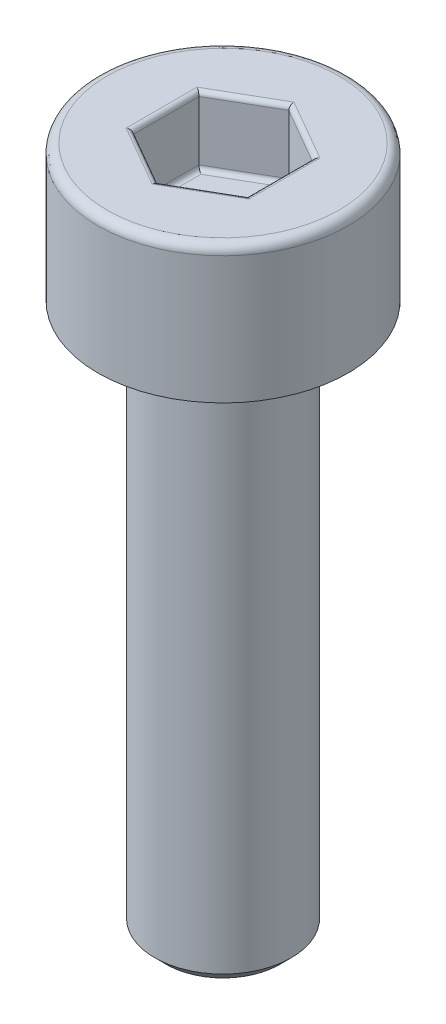
ISO-10303-21;
HEADER;
FILE_DESCRIPTION(('STEP AP214'),'2;1');
FILE_NAME('part.step','',(''),(''),'','','');
FILE_SCHEMA(('AUTOMOTIVE_DESIGN { 1 0 10303 214 1 1 1 1 }'));
ENDSEC;
DATA;
#1=APPLICATION_CONTEXT('core data for automotive mechanical design processes');
#2=APPLICATION_PROTOCOL_DEFINITION('international standard','automotive_design',2000,#1);
#3=PRODUCT_CONTEXT('',#1,'mechanical');
#4=PRODUCT('Part','Part','',(#3));
#5=PRODUCT_RELATED_PRODUCT_CATEGORY('part','',(#4));
#6=PRODUCT_DEFINITION_FORMATION('','',#4);
#7=PRODUCT_DEFINITION_CONTEXT('part definition',#1,'design');
#8=PRODUCT_DEFINITION('design','',#6,#7);
#9=PRODUCT_DEFINITION_SHAPE('','',#8);
#10=(LENGTH_UNIT() NAMED_UNIT(*) SI_UNIT(.MILLI.,.METRE.));
#11=(NAMED_UNIT(*) PLANE_ANGLE_UNIT() SI_UNIT($,.RADIAN.));
#12=(NAMED_UNIT(*) SI_UNIT($,.STERADIAN.) SOLID_ANGLE_UNIT());
#13=UNCERTAINTY_MEASURE_WITH_UNIT(LENGTH_MEASURE(1.E-05),#10,'distance_accuracy_value','');
#14=(GEOMETRIC_REPRESENTATION_CONTEXT(3) GLOBAL_UNCERTAINTY_ASSIGNED_CONTEXT((#13)) GLOBAL_UNIT_ASSIGNED_CONTEXT((#10,
#11,#12)) REPRESENTATION_CONTEXT('',''));
#15=CARTESIAN_POINT('',(0.,0.,0.));
#16=DIRECTION('',(0.,0.,1.));
#17=DIRECTION('',(1.,0.,0.));
#18=AXIS2_PLACEMENT_3D('',#15,#16,#17);
#19=CARTESIAN_POINT('',(0.,-15.,0.));
#20=DIRECTION('',(0.,-1.,0.));
#21=DIRECTION('',(0.,0.,-1.));
#22=AXIS2_PLACEMENT_3D('',#19,#20,#21);
#23=PLANE('',#22);
#24=CARTESIAN_POINT('',(0.,-15.,0.));
#25=DIRECTION('',(0.,-1.,0.));
#26=DIRECTION('',(0.,0.,-1.));
#27=AXIS2_PLACEMENT_3D('',#24,#25,#26);
#28=CIRCLE('',#27,1.25);
#29=CARTESIAN_POINT('',(0.,-15.,-1.25));
#30=VERTEX_POINT('',#29);
#31=EDGE_CURVE('E262',#30,#30,#28,.T.);
#32=ORIENTED_EDGE('',*,*,#31,.T.);
#33=EDGE_LOOP('',(#32));
#34=FACE_BOUND('',#33,.T.);
#35=ADVANCED_FACE('F34',(#34),#23,.T.);
#36=CARTESIAN_POINT('',(0.,0.,0.));
#37=DIRECTION('',(0.,1.,0.));
#38=DIRECTION('',(0.,0.,1.));
#39=AXIS2_PLACEMENT_3D('',#36,#37,#38);
#40=CYLINDRICAL_SURFACE('',#39,1.5);
#41=CARTESIAN_POINT('',(0.,-3.25,0.));
#42=DIRECTION('',(0.,-1.,0.));
#43=DIRECTION('',(0.,0.,-1.));
#44=AXIS2_PLACEMENT_3D('',#41,#42,#43);
#45=CIRCLE('',#44,1.5);
#46=CARTESIAN_POINT('',(0.,-3.25,-1.5));
#47=VERTEX_POINT('',#46);
#48=EDGE_CURVE('E259',#47,#47,#45,.T.);
#49=ORIENTED_EDGE('',*,*,#48,.T.);
#50=EDGE_LOOP('',(#49));
#51=FACE_BOUND('',#50,.T.);
#52=CARTESIAN_POINT('',(0.,-14.75,0.));
#53=DIRECTION('',(0.,-1.,0.));
#54=DIRECTION('',(0.,0.,-1.));
#55=AXIS2_PLACEMENT_3D('',#52,#53,#54);
#56=CIRCLE('',#55,1.5);
#57=CARTESIAN_POINT('',(0.,-14.75,-1.5));
#58=VERTEX_POINT('',#57);
#59=EDGE_CURVE('E256',#58,#58,#56,.F.);
#60=ORIENTED_EDGE('',*,*,#59,.T.);
#61=EDGE_LOOP('',(#60));
#62=FACE_BOUND('',#61,.T.);
#63=ADVANCED_FACE('F288',(#51,#62),#40,.T.);
#64=CARTESIAN_POINT('',(-1.5,-3.,0.));
#65=DIRECTION('',(0.,-1.,0.));
#66=DIRECTION('',(0.,0.,-1.));
#67=AXIS2_PLACEMENT_3D('',#64,#65,#66);
#68=PLANE('',#67);
#69=CARTESIAN_POINT('',(0.,-3.,0.));
#70=DIRECTION('',(0.,-1.,0.));
#71=DIRECTION('',(0.,0.,-1.));
#72=AXIS2_PLACEMENT_3D('',#69,#70,#71);
#73=CIRCLE('',#72,1.75);
#74=CARTESIAN_POINT('',(0.,-3.,-1.75));
#75=VERTEX_POINT('',#74);
#76=EDGE_CURVE('E253',#75,#75,#73,.F.);
#77=ORIENTED_EDGE('',*,*,#76,.T.);
#78=EDGE_LOOP('',(#77));
#79=FACE_BOUND('',#78,.T.);
#80=CARTESIAN_POINT('',(0.,-3.,0.));
#81=DIRECTION('',(0.,1.,0.));
#82=DIRECTION('',(0.,0.,1.));
#83=AXIS2_PLACEMENT_3D('',#80,#81,#82);
#84=CIRCLE('',#83,2.75);
#85=CARTESIAN_POINT('',(0.,-3.,2.75));
#86=VERTEX_POINT('',#85);
#87=EDGE_CURVE('E250',#86,#86,#84,.T.);
#88=ORIENTED_EDGE('',*,*,#87,.F.);
#89=EDGE_LOOP('',(#88));
#90=FACE_BOUND('',#89,.T.);
#91=ADVANCED_FACE('F294',(#79,#90),#68,.T.);
#92=CARTESIAN_POINT('',(0.,0.,0.));
#93=DIRECTION('',(0.,1.,0.));
#94=DIRECTION('',(0.,0.,1.));
#95=AXIS2_PLACEMENT_3D('',#92,#93,#94);
#96=CYLINDRICAL_SURFACE('',#95,2.75);
#97=CARTESIAN_POINT('',(0.,-0.2,0.));
#98=DIRECTION('',(0.,1.,0.));
#99=DIRECTION('',(0.,0.,1.));
#100=AXIS2_PLACEMENT_3D('',#97,#98,#99);
#101=CIRCLE('',#100,2.75);
#102=CARTESIAN_POINT('',(0.,-0.2,2.75));
#103=VERTEX_POINT('',#102);
#104=EDGE_CURVE('E160',#103,#103,#101,.F.);
#105=ORIENTED_EDGE('',*,*,#104,.T.);
#106=EDGE_LOOP('',(#105));
#107=FACE_BOUND('',#106,.T.);
#108=ORIENTED_EDGE('',*,*,#87,.T.);
#109=EDGE_LOOP('',(#108));
#110=FACE_BOUND('',#109,.T.);
#111=ADVANCED_FACE('F304',(#107,#110),#96,.T.);
#112=CARTESIAN_POINT('',(-2.75,0.,0.));
#113=DIRECTION('',(0.,1.,0.));
#114=DIRECTION('',(0.,0.,1.));
#115=AXIS2_PLACEMENT_3D('',#112,#113,#114);
#116=PLANE('',#115);
#117=DIRECTION('',(0.,0.,1.));
#118=VECTOR('',#117,1.);
#119=CARTESIAN_POINT('',(-1.35,0.,-0.721687836487034));
#120=LINE('',#119,#118);
#121=CARTESIAN_POINT('',(-1.35,0.,0.779422863405994));
#122=VERTEX_POINT('',#121);
#123=CARTESIAN_POINT('',(-1.35,0.,-0.779422863405996));
#124=VERTEX_POINT('',#123);
#125=EDGE_CURVE('E176',#122,#124,#120,.F.);
#126=ORIENTED_EDGE('',*,*,#125,.T.);
#127=DIRECTION('',(-0.866025403784439,0.,0.5));
#128=VECTOR('',#127,1.);
#129=CARTESIAN_POINT('',(-0.0500000000000009,0.,-1.52997821335251));
#130=LINE('',#129,#128);
#131=CARTESIAN_POINT('',(0.,0.,-1.55884572681199));
#132=VERTEX_POINT('',#131);
#133=EDGE_CURVE('E135',#124,#132,#130,.F.);
#134=ORIENTED_EDGE('',*,*,#133,.T.);
#135=DIRECTION('',(-0.866025403784439,0.,-0.5));
#136=VECTOR('',#135,1.);
#137=CARTESIAN_POINT('',(1.3,0.,-0.808290376865478));
#138=LINE('',#137,#136);
#139=CARTESIAN_POINT('',(1.35,0.,-0.779422863405996));
#140=VERTEX_POINT('',#139);
#141=EDGE_CURVE('E162',#132,#140,#138,.F.);
#142=ORIENTED_EDGE('',*,*,#141,.T.);
#143=DIRECTION('',(0.,0.,-1.));
#144=VECTOR('',#143,1.);
#145=CARTESIAN_POINT('',(1.35,0.,0.721687836487032));
#146=LINE('',#145,#144);
#147=CARTESIAN_POINT('',(1.35,0.,0.779422863405995));
#148=VERTEX_POINT('',#147);
#149=EDGE_CURVE('E170',#140,#148,#146,.F.);
#150=ORIENTED_EDGE('',*,*,#149,.T.);
#151=DIRECTION('',(0.866025403784439,0.,-0.5));
#152=VECTOR('',#151,1.);
#153=CARTESIAN_POINT('',(0.0499999999999991,0.,1.52997821335251));
#154=LINE('',#153,#152);
#155=CARTESIAN_POINT('',(0.,0.,1.55884572681199));
#156=VERTEX_POINT('',#155);
#157=EDGE_CURVE('E172',#148,#156,#154,.F.);
#158=ORIENTED_EDGE('',*,*,#157,.T.);
#159=DIRECTION('',(0.866025403784439,0.,0.5));
#160=VECTOR('',#159,1.);
#161=CARTESIAN_POINT('',(-1.3,0.,0.808290376865476));
#162=LINE('',#161,#160);
#163=EDGE_CURVE('E174',#156,#122,#162,.F.);
#164=ORIENTED_EDGE('',*,*,#163,.T.);
#165=EDGE_LOOP('',(#126,#134,#142,#150,#158,#164));
#166=FACE_BOUND('',#165,.T.);
#167=CARTESIAN_POINT('',(0.,0.,0.));
#168=DIRECTION('',(0.,1.,0.));
#169=DIRECTION('',(0.,0.,1.));
#170=AXIS2_PLACEMENT_3D('',#167,#168,#169);
#171=CIRCLE('',#170,2.55);
#172=CARTESIAN_POINT('',(0.,0.,2.55));
#173=VERTEX_POINT('',#172);
#174=EDGE_CURVE('E165',#173,#173,#171,.T.);
#175=ORIENTED_EDGE('',*,*,#174,.T.);
#176=EDGE_LOOP('',(#175));
#177=FACE_BOUND('',#176,.T.);
#178=ADVANCED_FACE('F267',(#166,#177),#116,.T.);
#179=CARTESIAN_POINT('',(0.,-3.,0.));
#180=DIRECTION('',(0.,1.,0.));
#181=DIRECTION('',(0.,0.,1.));
#182=AXIS2_PLACEMENT_3D('',#179,#180,#181);
#183=CONICAL_SURFACE('',#182,1.75,0.785398163397452);
#184=ORIENTED_EDGE('',*,*,#48,.F.);
#185=EDGE_LOOP('',(#184));
#186=FACE_BOUND('',#185,.T.);
#187=ORIENTED_EDGE('',*,*,#76,.F.);
#188=EDGE_LOOP('',(#187));
#189=FACE_BOUND('',#188,.T.);
#190=ADVANCED_FACE('F282',(#186,#189),#183,.T.);
#191=CARTESIAN_POINT('',(0.,-14.75,0.));
#192=DIRECTION('',(0.,1.,0.));
#193=DIRECTION('',(0.,0.,1.));
#194=AXIS2_PLACEMENT_3D('',#191,#192,#193);
#195=CONICAL_SURFACE('',#194,1.5,0.785398163397447);
#196=ORIENTED_EDGE('',*,*,#31,.F.);
#197=EDGE_LOOP('',(#196));
#198=FACE_BOUND('',#197,.T.);
#199=ORIENTED_EDGE('',*,*,#59,.F.);
#200=EDGE_LOOP('',(#199));
#201=FACE_BOUND('',#200,.T.);
#202=ADVANCED_FACE('F272',(#198,#201),#195,.T.);
#203=CARTESIAN_POINT('',(0.,-0.2,0.));
#204=DIRECTION('',(0.,1.,0.));
#205=DIRECTION('',(0.,0.,1.));
#206=AXIS2_PLACEMENT_3D('',#203,#204,#205);
#207=TOROIDAL_SURFACE('',#206,2.55,0.2);
#208=ORIENTED_EDGE('',*,*,#104,.F.);
#209=EDGE_LOOP('',(#208));
#210=FACE_BOUND('',#209,.T.);
#211=ORIENTED_EDGE('',*,*,#174,.F.);
#212=EDGE_LOOP('',(#211));
#213=FACE_BOUND('',#212,.T.);
#214=ADVANCED_FACE('F269',(#210,#213),#207,.T.);
#215=CARTESIAN_POINT('',(1.25,-1.5,-0.721687836487034));
#216=DIRECTION('',(0.5,0.,-0.866025403784439));
#217=DIRECTION('',(-0.866025403784439,0.,-0.5));
#218=AXIS2_PLACEMENT_3D('',#215,#216,#217);
#219=PLANE('',#218);
#220=DIRECTION('',(0.,1.,0.));
#221=VECTOR('',#220,1.);
#222=CARTESIAN_POINT('',(1.25,-1.5,-0.721687836487034));
#223=LINE('',#222,#221);
#224=CARTESIAN_POINT('',(1.25,-1.4,-0.721687836487034));
#225=VERTEX_POINT('',#224);
#226=CARTESIAN_POINT('',(1.25,-0.1,-0.721687836487034));
#227=VERTEX_POINT('',#226);
#228=EDGE_CURVE('E244',#225,#227,#223,.T.);
#229=ORIENTED_EDGE('',*,*,#228,.T.);
#230=DIRECTION('',(-0.866025403784439,0.,-0.5));
#231=VECTOR('',#230,1.);
#232=CARTESIAN_POINT('',(0.,-0.1,-1.44337567297407));
#233=LINE('',#232,#231);
#234=CARTESIAN_POINT('',(0.,-0.1,-1.44337567297407));
#235=VERTEX_POINT('',#234);
#236=EDGE_CURVE('E196',#227,#235,#233,.T.);
#237=ORIENTED_EDGE('',*,*,#236,.T.);
#238=DIRECTION('',(0.,1.,0.));
#239=VECTOR('',#238,1.);
#240=CARTESIAN_POINT('',(0.,-1.5,-1.44337567297407));
#241=LINE('',#240,#239);
#242=CARTESIAN_POINT('',(0.,-1.4,-1.44337567297407));
#243=VERTEX_POINT('',#242);
#244=EDGE_CURVE('E146',#243,#235,#241,.T.);
#245=ORIENTED_EDGE('',*,*,#244,.F.);
#246=DIRECTION('',(-0.866025403784439,0.,-0.5));
#247=VECTOR('',#246,1.);
#248=CARTESIAN_POINT('',(1.25,-1.4,-0.721687836487034));
#249=LINE('',#248,#247);
#250=EDGE_CURVE('E194',#243,#225,#249,.F.);
#251=ORIENTED_EDGE('',*,*,#250,.T.);
#252=EDGE_LOOP('',(#229,#237,#245,#251));
#253=FACE_BOUND('',#252,.T.);
#254=ADVANCED_FACE('F271',(#253),#219,.F.);
#255=CARTESIAN_POINT('',(1.25,-1.5,0.721687836487032));
#256=DIRECTION('',(1.,0.,0.));
#257=DIRECTION('',(0.,0.,-1.));
#258=AXIS2_PLACEMENT_3D('',#255,#256,#257);
#259=PLANE('',#258);
#260=DIRECTION('',(0.,1.,0.));
#261=VECTOR('',#260,1.);
#262=CARTESIAN_POINT('',(1.25,-1.5,0.721687836487032));
#263=LINE('',#262,#261);
#264=CARTESIAN_POINT('',(1.25,-1.4,0.721687836487032));
#265=VERTEX_POINT('',#264);
#266=CARTESIAN_POINT('',(1.25,-0.1,0.721687836487032));
#267=VERTEX_POINT('',#266);
#268=EDGE_CURVE('E241',#265,#267,#263,.T.);
#269=ORIENTED_EDGE('',*,*,#268,.T.);
#270=DIRECTION('',(0.,0.,-1.));
#271=VECTOR('',#270,1.);
#272=CARTESIAN_POINT('',(1.25,-0.1,-0.721687836487034));
#273=LINE('',#272,#271);
#274=EDGE_CURVE('E192',#267,#227,#273,.T.);
#275=ORIENTED_EDGE('',*,*,#274,.T.);
#276=ORIENTED_EDGE('',*,*,#228,.F.);
#277=DIRECTION('',(0.,0.,-1.));
#278=VECTOR('',#277,1.);
#279=CARTESIAN_POINT('',(1.25,-1.4,0.721687836487032));
#280=LINE('',#279,#278);
#281=EDGE_CURVE('E189',#225,#265,#280,.F.);
#282=ORIENTED_EDGE('',*,*,#281,.T.);
#283=EDGE_LOOP('',(#269,#275,#276,#282));
#284=FACE_BOUND('',#283,.T.);
#285=ADVANCED_FACE('F279',(#284),#259,.F.);
#286=CARTESIAN_POINT('',(0.,-1.5,1.44337567297406));
#287=DIRECTION('',(0.5,0.,0.866025403784439));
#288=DIRECTION('',(0.866025403784439,0.,-0.5));
#289=AXIS2_PLACEMENT_3D('',#286,#287,#288);
#290=PLANE('',#289);
#291=DIRECTION('',(0.,1.,0.));
#292=VECTOR('',#291,1.);
#293=CARTESIAN_POINT('',(0.,-1.5,1.44337567297406));
#294=LINE('',#293,#292);
#295=CARTESIAN_POINT('',(0.,-1.4,1.44337567297406));
#296=VERTEX_POINT('',#295);
#297=CARTESIAN_POINT('',(0.,-0.1,1.44337567297406));
#298=VERTEX_POINT('',#297);
#299=EDGE_CURVE('E238',#296,#298,#294,.T.);
#300=ORIENTED_EDGE('',*,*,#299,.T.);
#301=DIRECTION('',(0.866025403784439,0.,-0.5));
#302=VECTOR('',#301,1.);
#303=CARTESIAN_POINT('',(1.25,-0.1,0.721687836487032));
#304=LINE('',#303,#302);
#305=EDGE_CURVE('E187',#298,#267,#304,.T.);
#306=ORIENTED_EDGE('',*,*,#305,.T.);
#307=ORIENTED_EDGE('',*,*,#268,.F.);
#308=DIRECTION('',(0.866025403784439,0.,-0.5));
#309=VECTOR('',#308,1.);
#310=CARTESIAN_POINT('',(0.,-1.4,1.44337567297406));
#311=LINE('',#310,#309);
#312=EDGE_CURVE('E185',#265,#296,#311,.F.);
#313=ORIENTED_EDGE('',*,*,#312,.T.);
#314=EDGE_LOOP('',(#300,#306,#307,#313));
#315=FACE_BOUND('',#314,.T.);
#316=ADVANCED_FACE('F328',(#315),#290,.F.);
#317=CARTESIAN_POINT('',(-1.25,-1.5,0.721687836487032));
#318=DIRECTION('',(-0.5,0.,0.866025403784439));
#319=DIRECTION('',(0.866025403784439,0.,0.5));
#320=AXIS2_PLACEMENT_3D('',#317,#318,#319);
#321=PLANE('',#320);
#322=DIRECTION('',(0.,1.,0.));
#323=VECTOR('',#322,1.);
#324=CARTESIAN_POINT('',(-1.25,-1.5,0.721687836487032));
#325=LINE('',#324,#323);
#326=CARTESIAN_POINT('',(-1.25,-1.4,0.721687836487032));
#327=VERTEX_POINT('',#326);
#328=CARTESIAN_POINT('',(-1.25,-0.1,0.721687836487032));
#329=VERTEX_POINT('',#328);
#330=EDGE_CURVE('E129',#327,#329,#325,.T.);
#331=ORIENTED_EDGE('',*,*,#330,.T.);
#332=DIRECTION('',(0.866025403784439,0.,0.5));
#333=VECTOR('',#332,1.);
#334=CARTESIAN_POINT('',(0.,-0.1,1.44337567297406));
#335=LINE('',#334,#333);
#336=EDGE_CURVE('E183',#329,#298,#335,.T.);
#337=ORIENTED_EDGE('',*,*,#336,.T.);
#338=ORIENTED_EDGE('',*,*,#299,.F.);
#339=DIRECTION('',(0.866025403784439,0.,0.5));
#340=VECTOR('',#339,1.);
#341=CARTESIAN_POINT('',(-1.25,-1.4,0.721687836487032));
#342=LINE('',#341,#340);
#343=EDGE_CURVE('E181',#296,#327,#342,.F.);
#344=ORIENTED_EDGE('',*,*,#343,.T.);
#345=EDGE_LOOP('',(#331,#337,#338,#344));
#346=FACE_BOUND('',#345,.T.);
#347=ADVANCED_FACE('F235',(#346),#321,.F.);
#348=CARTESIAN_POINT('',(-1.25,-1.5,-0.721687836487034));
#349=DIRECTION('',(-1.,0.,0.));
#350=DIRECTION('',(0.,0.,1.));
#351=AXIS2_PLACEMENT_3D('',#348,#349,#350);
#352=PLANE('',#351);
#353=DIRECTION('',(0.,1.,0.));
#354=VECTOR('',#353,1.);
#355=CARTESIAN_POINT('',(-1.25,-1.5,-0.721687836487034));
#356=LINE('',#355,#354);
#357=CARTESIAN_POINT('',(-1.25,-1.4,-0.721687836487034));
#358=VERTEX_POINT('',#357);
#359=CARTESIAN_POINT('',(-1.25,-0.1,-0.721687836487034));
#360=VERTEX_POINT('',#359);
#361=EDGE_CURVE('E127',#358,#360,#356,.T.);
#362=ORIENTED_EDGE('',*,*,#361,.T.);
#363=DIRECTION('',(0.,0.,1.));
#364=VECTOR('',#363,1.);
#365=CARTESIAN_POINT('',(-1.25,-0.1,0.721687836487032));
#366=LINE('',#365,#364);
#367=EDGE_CURVE('E134',#360,#329,#366,.T.);
#368=ORIENTED_EDGE('',*,*,#367,.T.);
#369=ORIENTED_EDGE('',*,*,#330,.F.);
#370=DIRECTION('',(0.,0.,1.));
#371=VECTOR('',#370,1.);
#372=CARTESIAN_POINT('',(-1.25,-1.4,-0.721687836487034));
#373=LINE('',#372,#371);
#374=EDGE_CURVE('E124',#327,#358,#373,.F.);
#375=ORIENTED_EDGE('',*,*,#374,.T.);
#376=EDGE_LOOP('',(#362,#368,#369,#375));
#377=FACE_BOUND('',#376,.T.);
#378=ADVANCED_FACE('F126',(#377),#352,.F.);
#379=CARTESIAN_POINT('',(0.,-1.5,-1.44337567297407));
#380=DIRECTION('',(-0.5,0.,-0.866025403784439));
#381=DIRECTION('',(-0.866025403784439,0.,0.5));
#382=AXIS2_PLACEMENT_3D('',#379,#380,#381);
#383=PLANE('',#382);
#384=ORIENTED_EDGE('',*,*,#244,.T.);
#385=DIRECTION('',(-0.866025403784439,0.,0.5));
#386=VECTOR('',#385,1.);
#387=CARTESIAN_POINT('',(-1.25,-0.1,-0.721687836487033));
#388=LINE('',#387,#386);
#389=EDGE_CURVE('E145',#235,#360,#388,.T.);
#390=ORIENTED_EDGE('',*,*,#389,.T.);
#391=ORIENTED_EDGE('',*,*,#361,.F.);
#392=DIRECTION('',(-0.866025403784439,0.,0.5));
#393=VECTOR('',#392,1.);
#394=CARTESIAN_POINT('',(0.,-1.4,-1.44337567297407));
#395=LINE('',#394,#393);
#396=EDGE_CURVE('E142',#358,#243,#395,.F.);
#397=ORIENTED_EDGE('',*,*,#396,.T.);
#398=EDGE_LOOP('',(#384,#390,#391,#397));
#399=FACE_BOUND('',#398,.T.);
#400=ADVANCED_FACE('F140',(#399),#383,.F.);
#401=CARTESIAN_POINT('',(1.25,-1.5,-0.721687836487033));
#402=DIRECTION('',(0.,-1.,0.));
#403=DIRECTION('',(0.,0.,-1.));
#404=AXIS2_PLACEMENT_3D('',#401,#402,#403);
#405=PLANE('',#404);
#406=DIRECTION('',(0.866025403784439,0.,-0.5));
#407=VECTOR('',#406,1.);
#408=CARTESIAN_POINT('',(1.2,-1.5,0.635085296108589));
#409=LINE('',#408,#407);
#410=CARTESIAN_POINT('',(0.,-1.5,1.32790561913614));
#411=VERTEX_POINT('',#410);
#412=CARTESIAN_POINT('',(1.15,-1.5,0.66395280956807));
#413=VERTEX_POINT('',#412);
#414=EDGE_CURVE('E43',#411,#413,#409,.T.);
#415=ORIENTED_EDGE('',*,*,#414,.T.);
#416=DIRECTION('',(0.,0.,-1.));
#417=VECTOR('',#416,1.);
#418=CARTESIAN_POINT('',(1.15,-1.5,-0.721687836487034));
#419=LINE('',#418,#417);
#420=CARTESIAN_POINT('',(1.15,-1.5,-0.663952809568071));
#421=VERTEX_POINT('',#420);
#422=EDGE_CURVE('E11',#413,#421,#419,.T.);
#423=ORIENTED_EDGE('',*,*,#422,.T.);
#424=DIRECTION('',(-0.866025403784439,0.,-0.5));
#425=VECTOR('',#424,1.);
#426=CARTESIAN_POINT('',(-0.050000000000001,-1.5,-1.35677313259562));
#427=LINE('',#426,#425);
#428=CARTESIAN_POINT('',(0.,-1.5,-1.32790561913614));
#429=VERTEX_POINT('',#428);
#430=EDGE_CURVE('E198',#421,#429,#427,.T.);
#431=ORIENTED_EDGE('',*,*,#430,.T.);
#432=DIRECTION('',(-0.866025403784439,0.,0.5));
#433=VECTOR('',#432,1.);
#434=CARTESIAN_POINT('',(-1.2,-1.5,-0.635085296108589));
#435=LINE('',#434,#433);
#436=CARTESIAN_POINT('',(-1.15,-1.5,-0.663952809568071));
#437=VERTEX_POINT('',#436);
#438=EDGE_CURVE('E200',#429,#437,#435,.T.);
#439=ORIENTED_EDGE('',*,*,#438,.T.);
#440=DIRECTION('',(0.,0.,1.));
#441=VECTOR('',#440,1.);
#442=CARTESIAN_POINT('',(-1.15,-1.5,0.721687836487032));
#443=LINE('',#442,#441);
#444=CARTESIAN_POINT('',(-1.15,-1.5,0.66395280956807));
#445=VERTEX_POINT('',#444);
#446=EDGE_CURVE('E151',#437,#445,#443,.T.);
#447=ORIENTED_EDGE('',*,*,#446,.T.);
#448=DIRECTION('',(0.866025403784439,0.,0.5));
#449=VECTOR('',#448,1.);
#450=CARTESIAN_POINT('',(0.049999999999999,-1.5,1.35677313259562));
#451=LINE('',#450,#449);
#452=EDGE_CURVE('E54',#445,#411,#451,.T.);
#453=ORIENTED_EDGE('',*,*,#452,.T.);
#454=EDGE_LOOP('',(#415,#423,#431,#439,#447,#453));
#455=FACE_BOUND('',#454,.T.);
#456=ADVANCED_FACE('F323',(#455),#405,.F.);
#457=CARTESIAN_POINT('',(0.0499999999999991,-0.1,1.52997821335251));
#458=DIRECTION('',(-0.866025403784439,0.,0.5));
#459=DIRECTION('',(0.5,0.,0.866025403784439));
#460=AXIS2_PLACEMENT_3D('',#457,#458,#459);
#461=CYLINDRICAL_SURFACE('',#460,0.1);
#462=CARTESIAN_POINT('',(0.,-0.1,1.55884572681199));
#463=DIRECTION('',(-1.,0.,0.));
#464=DIRECTION('',(0.,0.,-1.));
#465=AXIS2_PLACEMENT_3D('',#462,#463,#464);
#466=ELLIPSE('',#465,0.115470053837925,0.1);
#467=EDGE_CURVE('E215',#156,#298,#466,.T.);
#468=ORIENTED_EDGE('',*,*,#467,.F.);
#469=ORIENTED_EDGE('',*,*,#157,.F.);
#470=CARTESIAN_POINT('',(1.35,-0.1,0.779422863405995));
#471=DIRECTION('',(-0.5,0.,0.866025403784439));
#472=DIRECTION('',(-0.866025403784439,0.,-0.5));
#473=AXIS2_PLACEMENT_3D('',#470,#471,#472);
#474=ELLIPSE('',#473,0.115470053837925,0.1);
#475=EDGE_CURVE('E218',#267,#148,#474,.F.);
#476=ORIENTED_EDGE('',*,*,#475,.F.);
#477=ORIENTED_EDGE('',*,*,#305,.F.);
#478=EDGE_LOOP('',(#468,#469,#476,#477));
#479=FACE_BOUND('',#478,.T.);
#480=ADVANCED_FACE('F335',(#479),#461,.T.);
#481=CARTESIAN_POINT('',(1.35,-0.1,0.721687836487032));
#482=DIRECTION('',(0.,0.,1.));
#483=DIRECTION('',(1.,0.,0.));
#484=AXIS2_PLACEMENT_3D('',#481,#482,#483);
#485=CYLINDRICAL_SURFACE('',#484,0.1);
#486=ORIENTED_EDGE('',*,*,#475,.T.);
#487=ORIENTED_EDGE('',*,*,#149,.F.);
#488=CARTESIAN_POINT('',(1.35,-0.1,-0.779422863405996));
#489=DIRECTION('',(0.5,0.,0.866025403784439));
#490=DIRECTION('',(-0.866025403784439,0.,0.5));
#491=AXIS2_PLACEMENT_3D('',#488,#489,#490);
#492=ELLIPSE('',#491,0.115470053837925,0.1);
#493=EDGE_CURVE('E212',#227,#140,#492,.F.);
#494=ORIENTED_EDGE('',*,*,#493,.F.);
#495=ORIENTED_EDGE('',*,*,#274,.F.);
#496=EDGE_LOOP('',(#486,#487,#494,#495));
#497=FACE_BOUND('',#496,.T.);
#498=ADVANCED_FACE('F339',(#497),#485,.T.);
#499=CARTESIAN_POINT('',(-1.3,-0.1,0.808290376865476));
#500=DIRECTION('',(-0.866025403784439,0.,-0.5));
#501=DIRECTION('',(-0.5,0.,0.866025403784439));
#502=AXIS2_PLACEMENT_3D('',#499,#500,#501);
#503=CYLINDRICAL_SURFACE('',#502,0.1);
#504=ORIENTED_EDGE('',*,*,#467,.T.);
#505=ORIENTED_EDGE('',*,*,#336,.F.);
#506=CARTESIAN_POINT('',(-1.35,-0.1,0.779422863405994));
#507=DIRECTION('',(-0.5,0.,-0.866025403784439));
#508=DIRECTION('',(0.866025403784439,0.,-0.5));
#509=AXIS2_PLACEMENT_3D('',#506,#507,#508);
#510=ELLIPSE('',#509,0.115470053837925,0.1);
#511=EDGE_CURVE('E209',#122,#329,#510,.T.);
#512=ORIENTED_EDGE('',*,*,#511,.F.);
#513=ORIENTED_EDGE('',*,*,#163,.F.);
#514=EDGE_LOOP('',(#504,#505,#512,#513));
#515=FACE_BOUND('',#514,.T.);
#516=ADVANCED_FACE('F345',(#515),#503,.T.);
#517=CARTESIAN_POINT('',(1.3,-0.1,-0.808290376865478));
#518=DIRECTION('',(0.866025403784439,0.,0.5));
#519=DIRECTION('',(0.5,0.,-0.866025403784439));
#520=AXIS2_PLACEMENT_3D('',#517,#518,#519);
#521=CYLINDRICAL_SURFACE('',#520,0.1);
#522=ORIENTED_EDGE('',*,*,#493,.T.);
#523=ORIENTED_EDGE('',*,*,#141,.F.);
#524=CARTESIAN_POINT('',(0.,-0.1,-1.55884572681199));
#525=DIRECTION('',(1.,0.,0.));
#526=DIRECTION('',(0.,0.,-1.));
#527=AXIS2_PLACEMENT_3D('',#524,#525,#526);
#528=ELLIPSE('',#527,0.115470053837925,0.1);
#529=EDGE_CURVE('E207',#235,#132,#528,.F.);
#530=ORIENTED_EDGE('',*,*,#529,.F.);
#531=ORIENTED_EDGE('',*,*,#236,.F.);
#532=EDGE_LOOP('',(#522,#523,#530,#531));
#533=FACE_BOUND('',#532,.T.);
#534=ADVANCED_FACE('F375',(#533),#521,.T.);
#535=CARTESIAN_POINT('',(-1.35,-0.1,-0.721687836487034));
#536=DIRECTION('',(0.,0.,-1.));
#537=DIRECTION('',(-1.,0.,0.));
#538=AXIS2_PLACEMENT_3D('',#535,#536,#537);
#539=CYLINDRICAL_SURFACE('',#538,0.1);
#540=ORIENTED_EDGE('',*,*,#511,.T.);
#541=ORIENTED_EDGE('',*,*,#367,.F.);
#542=CARTESIAN_POINT('',(-1.35,-0.1,-0.779422863405996));
#543=DIRECTION('',(0.5,0.,-0.866025403784439));
#544=DIRECTION('',(0.866025403784439,0.,0.5));
#545=AXIS2_PLACEMENT_3D('',#542,#543,#544);
#546=ELLIPSE('',#545,0.115470053837925,0.1);
#547=EDGE_CURVE('E205',#124,#360,#546,.T.);
#548=ORIENTED_EDGE('',*,*,#547,.F.);
#549=ORIENTED_EDGE('',*,*,#125,.F.);
#550=EDGE_LOOP('',(#540,#541,#548,#549));
#551=FACE_BOUND('',#550,.T.);
#552=ADVANCED_FACE('F370',(#551),#539,.T.);
#553=CARTESIAN_POINT('',(-0.0500000000000009,-0.1,-1.52997821335251));
#554=DIRECTION('',(0.866025403784439,0.,-0.5));
#555=DIRECTION('',(-0.5,0.,-0.866025403784439));
#556=AXIS2_PLACEMENT_3D('',#553,#554,#555);
#557=CYLINDRICAL_SURFACE('',#556,0.1);
#558=ORIENTED_EDGE('',*,*,#529,.T.);
#559=ORIENTED_EDGE('',*,*,#133,.F.);
#560=ORIENTED_EDGE('',*,*,#547,.T.);
#561=ORIENTED_EDGE('',*,*,#389,.F.);
#562=EDGE_LOOP('',(#558,#559,#560,#561));
#563=FACE_BOUND('',#562,.T.);
#564=ADVANCED_FACE('F366',(#563),#557,.T.);
#565=CARTESIAN_POINT('',(-1.15,-1.4,-0.721687836487033));
#566=DIRECTION('',(0.,0.,-1.));
#567=DIRECTION('',(-1.,0.,0.));
#568=AXIS2_PLACEMENT_3D('',#565,#566,#567);
#569=CYLINDRICAL_SURFACE('',#568,0.1);
#570=CARTESIAN_POINT('',(-1.15,-1.4,-0.663952809568071));
#571=DIRECTION('',(0.5,0.,-0.866025403784439));
#572=DIRECTION('',(-0.866025403784439,0.,-0.5));
#573=AXIS2_PLACEMENT_3D('',#570,#571,#572);
#574=ELLIPSE('',#573,0.115470053837925,0.1);
#575=EDGE_CURVE('E150',#358,#437,#574,.F.);
#576=ORIENTED_EDGE('',*,*,#575,.F.);
#577=ORIENTED_EDGE('',*,*,#374,.F.);
#578=CARTESIAN_POINT('',(-1.15,-1.4,0.66395280956807));
#579=DIRECTION('',(-0.5,0.,-0.866025403784439));
#580=DIRECTION('',(-0.866025403784439,0.,0.5));
#581=AXIS2_PLACEMENT_3D('',#578,#579,#580);
#582=ELLIPSE('',#581,0.115470053837925,0.1);
#583=EDGE_CURVE('E38',#445,#327,#582,.T.);
#584=ORIENTED_EDGE('',*,*,#583,.F.);
#585=ORIENTED_EDGE('',*,*,#446,.F.);
#586=EDGE_LOOP('',(#576,#577,#584,#585));
#587=FACE_BOUND('',#586,.T.);
#588=ADVANCED_FACE('F36',(#587),#569,.F.);
#589=CARTESIAN_POINT('',(0.0499999999999984,-1.4,1.35677313259562));
#590=DIRECTION('',(-0.866025403784439,0.,-0.5));
#591=DIRECTION('',(-0.5,0.,0.866025403784439));
#592=AXIS2_PLACEMENT_3D('',#589,#590,#591);
#593=CYLINDRICAL_SURFACE('',#592,0.1);
#594=ORIENTED_EDGE('',*,*,#583,.T.);
#595=ORIENTED_EDGE('',*,*,#343,.F.);
#596=CARTESIAN_POINT('',(0.,-1.4,1.32790561913614));
#597=DIRECTION('',(-1.,0.,0.));
#598=DIRECTION('',(0.,0.,1.));
#599=AXIS2_PLACEMENT_3D('',#596,#597,#598);
#600=ELLIPSE('',#599,0.115470053837925,0.1);
#601=EDGE_CURVE('E154',#411,#296,#600,.T.);
#602=ORIENTED_EDGE('',*,*,#601,.F.);
#603=ORIENTED_EDGE('',*,*,#452,.F.);
#604=EDGE_LOOP('',(#594,#595,#602,#603));
#605=FACE_BOUND('',#604,.T.);
#606=ADVANCED_FACE('F232',(#605),#593,.F.);
#607=CARTESIAN_POINT('',(0.674999999999999,-1.4,-1.71761705083914));
#608=DIRECTION('',(0.866025403784439,0.,-0.5));
#609=DIRECTION('',(-0.5,0.,-0.866025403784439));
#610=AXIS2_PLACEMENT_3D('',#607,#608,#609);
#611=CYLINDRICAL_SURFACE('',#610,0.1);
#612=ORIENTED_EDGE('',*,*,#575,.T.);
#613=ORIENTED_EDGE('',*,*,#438,.F.);
#614=CARTESIAN_POINT('',(0.,-1.4,-1.32790561913614));
#615=DIRECTION('',(1.,0.,0.));
#616=DIRECTION('',(0.,0.,-1.));
#617=AXIS2_PLACEMENT_3D('',#614,#615,#616);
#618=ELLIPSE('',#617,0.115470053837925,0.1);
#619=EDGE_CURVE('E158',#243,#429,#618,.F.);
#620=ORIENTED_EDGE('',*,*,#619,.F.);
#621=ORIENTED_EDGE('',*,*,#396,.F.);
#622=EDGE_LOOP('',(#612,#613,#620,#621));
#623=FACE_BOUND('',#622,.T.);
#624=ADVANCED_FACE('F156',(#623),#611,.F.);
#625=CARTESIAN_POINT('',(1.825,-1.4,0.274241377865073));
#626=DIRECTION('',(-0.866025403784439,0.,0.5));
#627=DIRECTION('',(0.5,0.,0.866025403784439));
#628=AXIS2_PLACEMENT_3D('',#625,#626,#627);
#629=CYLINDRICAL_SURFACE('',#628,0.1);
#630=ORIENTED_EDGE('',*,*,#601,.T.);
#631=ORIENTED_EDGE('',*,*,#312,.F.);
#632=CARTESIAN_POINT('',(1.15,-1.4,0.66395280956807));
#633=DIRECTION('',(-0.5,0.,0.866025403784439));
#634=DIRECTION('',(0.866025403784439,0.,0.5));
#635=AXIS2_PLACEMENT_3D('',#632,#633,#634);
#636=ELLIPSE('',#635,0.115470053837925,0.1);
#637=EDGE_CURVE('E223',#413,#265,#636,.T.);
#638=ORIENTED_EDGE('',*,*,#637,.F.);
#639=ORIENTED_EDGE('',*,*,#414,.F.);
#640=EDGE_LOOP('',(#630,#631,#638,#639));
#641=FACE_BOUND('',#640,.T.);
#642=ADVANCED_FACE('F229',(#641),#629,.F.);
#643=CARTESIAN_POINT('',(1.2,-1.4,-0.63508529610859));
#644=DIRECTION('',(0.866025403784439,0.,0.5));
#645=DIRECTION('',(0.5,0.,-0.866025403784439));
#646=AXIS2_PLACEMENT_3D('',#643,#644,#645);
#647=CYLINDRICAL_SURFACE('',#646,0.1);
#648=ORIENTED_EDGE('',*,*,#619,.T.);
#649=ORIENTED_EDGE('',*,*,#430,.F.);
#650=CARTESIAN_POINT('',(1.15,-1.4,-0.663952809568071));
#651=DIRECTION('',(0.5,0.,0.866025403784439));
#652=DIRECTION('',(-0.866025403784439,0.,0.5));
#653=AXIS2_PLACEMENT_3D('',#650,#651,#652);
#654=ELLIPSE('',#653,0.115470053837925,0.1);
#655=EDGE_CURVE('E221',#225,#421,#654,.F.);
#656=ORIENTED_EDGE('',*,*,#655,.F.);
#657=ORIENTED_EDGE('',*,*,#250,.F.);
#658=EDGE_LOOP('',(#648,#649,#656,#657));
#659=FACE_BOUND('',#658,.T.);
#660=ADVANCED_FACE('F354',(#659),#647,.F.);
#661=CARTESIAN_POINT('',(1.15,-1.4,-0.721687836487033));
#662=DIRECTION('',(0.,0.,1.));
#663=DIRECTION('',(1.,0.,0.));
#664=AXIS2_PLACEMENT_3D('',#661,#662,#663);
#665=CYLINDRICAL_SURFACE('',#664,0.1);
#666=ORIENTED_EDGE('',*,*,#637,.T.);
#667=ORIENTED_EDGE('',*,*,#281,.F.);
#668=ORIENTED_EDGE('',*,*,#655,.T.);
#669=ORIENTED_EDGE('',*,*,#422,.F.);
#670=EDGE_LOOP('',(#666,#667,#668,#669));
#671=FACE_BOUND('',#670,.T.);
#672=ADVANCED_FACE('F351',(#671),#665,.F.);
#673=CLOSED_SHELL('',(#35,#63,#91,#111,#178,#190,#202,#214,#254,#285,#316,#347,#378,#400,#456,
#480,#498,#516,#534,#552,#564,#588,#606,#624,#642,#660,#672));
#674=MANIFOLD_SOLID_BREP('B2',#673);
#675=ADVANCED_BREP_SHAPE_REPRESENTATION('',(#18,#674),#14);
#676=SHAPE_DEFINITION_REPRESENTATION(#9,#675);
ENDSEC;
END-ISO-10303-21;
